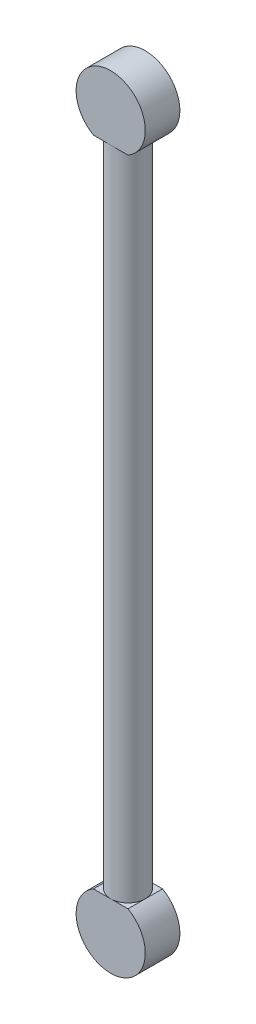
ISO-10303-21;
HEADER;
FILE_DESCRIPTION(('STEP AP214'),'2;1');
FILE_NAME('part.step','',(''),(''),'','','');
FILE_SCHEMA(('AUTOMOTIVE_DESIGN { 1 0 10303 214 1 1 1 1 }'));
ENDSEC;
DATA;
#1=APPLICATION_CONTEXT('core data for automotive mechanical design processes');
#2=APPLICATION_PROTOCOL_DEFINITION('international standard','automotive_design',2000,#1);
#3=PRODUCT_CONTEXT('',#1,'mechanical');
#4=PRODUCT('Part','Part','',(#3));
#5=PRODUCT_RELATED_PRODUCT_CATEGORY('part','',(#4));
#6=PRODUCT_DEFINITION_FORMATION('','',#4);
#7=PRODUCT_DEFINITION_CONTEXT('part definition',#1,'design');
#8=PRODUCT_DEFINITION('design','',#6,#7);
#9=PRODUCT_DEFINITION_SHAPE('','',#8);
#10=(LENGTH_UNIT() NAMED_UNIT(*) SI_UNIT(.MILLI.,.METRE.));
#11=(NAMED_UNIT(*) PLANE_ANGLE_UNIT() SI_UNIT($,.RADIAN.));
#12=(NAMED_UNIT(*) SI_UNIT($,.STERADIAN.) SOLID_ANGLE_UNIT());
#13=UNCERTAINTY_MEASURE_WITH_UNIT(LENGTH_MEASURE(1.E-05),#10,'distance_accuracy_value','');
#14=(GEOMETRIC_REPRESENTATION_CONTEXT(3) GLOBAL_UNCERTAINTY_ASSIGNED_CONTEXT((#13)) GLOBAL_UNIT_ASSIGNED_CONTEXT((#10,
#11,#12)) REPRESENTATION_CONTEXT('',''));
#15=CARTESIAN_POINT('',(0.,0.,0.));
#16=DIRECTION('',(0.,0.,1.));
#17=DIRECTION('',(1.,0.,0.));
#18=AXIS2_PLACEMENT_3D('',#15,#16,#17);
#19=CARTESIAN_POINT('',(0.,119.888,0.));
#20=DIRECTION('',(0.,-1.,0.));
#21=DIRECTION('',(0.,0.,-1.));
#22=AXIS2_PLACEMENT_3D('',#19,#20,#21);
#23=CYLINDRICAL_SURFACE('',#22,3.175);
#24=CARTESIAN_POINT('',(0.,119.888,0.));
#25=DIRECTION('',(0.,1.,0.));
#26=DIRECTION('',(0.,0.,1.));
#27=AXIS2_PLACEMENT_3D('',#24,#25,#26);
#28=CIRCLE('',#27,3.175);
#29=CARTESIAN_POINT('',(0.,119.888,3.175));
#30=VERTEX_POINT('',#29);
#31=CARTESIAN_POINT('',(3.175,119.888,0.));
#32=VERTEX_POINT('',#31);
#33=EDGE_CURVE('E11',#30,#32,#28,.T.);
#34=ORIENTED_EDGE('',*,*,#33,.F.);
#35=CARTESIAN_POINT('',(-3.175,119.888,0.));
#36=VERTEX_POINT('',#35);
#37=EDGE_CURVE('E47',#36,#30,#28,.T.);
#38=ORIENTED_EDGE('',*,*,#37,.F.);
#39=CARTESIAN_POINT('',(0.,119.888,-3.175));
#40=VERTEX_POINT('',#39);
#41=EDGE_CURVE('E157',#40,#36,#28,.T.);
#42=ORIENTED_EDGE('',*,*,#41,.F.);
#43=EDGE_CURVE('E46',#32,#40,#28,.T.);
#44=ORIENTED_EDGE('',*,*,#43,.F.);
#45=EDGE_LOOP('',(#34,#38,#42,#44));
#46=FACE_BOUND('',#45,.T.);
#47=CARTESIAN_POINT('',(0.,0.,0.));
#48=DIRECTION('',(0.,1.,0.));
#49=DIRECTION('',(0.,0.,1.));
#50=AXIS2_PLACEMENT_3D('',#47,#48,#49);
#51=CIRCLE('',#50,3.175);
#52=CARTESIAN_POINT('',(0.,0.,3.175));
#53=VERTEX_POINT('',#52);
#54=CARTESIAN_POINT('',(3.175,0.,0.));
#55=VERTEX_POINT('',#54);
#56=EDGE_CURVE('E41',#53,#55,#51,.T.);
#57=ORIENTED_EDGE('',*,*,#56,.T.);
#58=CARTESIAN_POINT('',(0.,0.,-3.175));
#59=VERTEX_POINT('',#58);
#60=EDGE_CURVE('E172',#55,#59,#51,.T.);
#61=ORIENTED_EDGE('',*,*,#60,.T.);
#62=CARTESIAN_POINT('',(-3.175,0.,0.));
#63=VERTEX_POINT('',#62);
#64=EDGE_CURVE('E152',#59,#63,#51,.T.);
#65=ORIENTED_EDGE('',*,*,#64,.T.);
#66=EDGE_CURVE('E149',#63,#53,#51,.T.);
#67=ORIENTED_EDGE('',*,*,#66,.T.);
#68=EDGE_LOOP('',(#57,#61,#65,#67));
#69=FACE_BOUND('',#68,.T.);
#70=ADVANCED_FACE('F38',(#46,#69),#23,.T.);
#71=CARTESIAN_POINT('',(-3.175,119.888,3.175));
#72=DIRECTION('',(0.,1.,0.));
#73=DIRECTION('',(0.,0.,1.));
#74=AXIS2_PLACEMENT_3D('',#71,#72,#73);
#75=PLANE('',#74);
#76=DIRECTION('',(1.,0.,0.));
#77=VECTOR('',#76,1.);
#78=CARTESIAN_POINT('',(-3.175,119.888,3.175));
#79=LINE('',#78,#77);
#80=CARTESIAN_POINT('',(3.175,119.888,3.175));
#81=VERTEX_POINT('',#80);
#82=EDGE_CURVE('E135',#30,#81,#79,.T.);
#83=ORIENTED_EDGE('',*,*,#82,.F.);
#84=ORIENTED_EDGE('',*,*,#33,.T.);
#85=DIRECTION('',(0.,0.,-1.));
#86=VECTOR('',#85,1.);
#87=CARTESIAN_POINT('',(3.175,119.888,3.175));
#88=LINE('',#87,#86);
#89=EDGE_CURVE('E143',#81,#32,#88,.T.);
#90=ORIENTED_EDGE('',*,*,#89,.F.);
#91=EDGE_LOOP('',(#83,#84,#90));
#92=FACE_BOUND('',#91,.T.);
#93=ADVANCED_FACE('F204',(#92),#75,.F.);
#94=CARTESIAN_POINT('',(3.175,119.888,-3.175));
#95=VERTEX_POINT('',#94);
#96=EDGE_CURVE('E139',#32,#95,#88,.T.);
#97=ORIENTED_EDGE('',*,*,#96,.F.);
#98=ORIENTED_EDGE('',*,*,#43,.T.);
#99=DIRECTION('',(1.,0.,0.));
#100=VECTOR('',#99,1.);
#101=CARTESIAN_POINT('',(-3.175,119.888,-3.175));
#102=LINE('',#101,#100);
#103=EDGE_CURVE('E127',#40,#95,#102,.T.);
#104=ORIENTED_EDGE('',*,*,#103,.T.);
#105=EDGE_LOOP('',(#97,#98,#104));
#106=FACE_BOUND('',#105,.T.);
#107=ADVANCED_FACE('F170',(#106),#75,.F.);
#108=CARTESIAN_POINT('',(-3.175,119.888,-3.175));
#109=VERTEX_POINT('',#108);
#110=EDGE_CURVE('E136',#109,#40,#102,.T.);
#111=ORIENTED_EDGE('',*,*,#110,.T.);
#112=ORIENTED_EDGE('',*,*,#41,.T.);
#113=DIRECTION('',(0.,0.,-1.));
#114=VECTOR('',#113,1.);
#115=CARTESIAN_POINT('',(-3.175,119.888,3.175));
#116=LINE('',#115,#114);
#117=EDGE_CURVE('E146',#36,#109,#116,.T.);
#118=ORIENTED_EDGE('',*,*,#117,.T.);
#119=EDGE_LOOP('',(#111,#112,#118));
#120=FACE_BOUND('',#119,.T.);
#121=ADVANCED_FACE('F156',(#120),#75,.F.);
#122=CARTESIAN_POINT('',(0.,125.387261314031,3.175));
#123=DIRECTION('',(0.,0.,-1.));
#124=DIRECTION('',(-1.,0.,0.));
#125=AXIS2_PLACEMENT_3D('',#122,#123,#124);
#126=CYLINDRICAL_SURFACE('',#125,6.35000000000001);
#127=CARTESIAN_POINT('',(0.,125.387261314031,-3.175));
#128=DIRECTION('',(0.,0.,1.));
#129=DIRECTION('',(-1.,0.,0.));
#130=AXIS2_PLACEMENT_3D('',#127,#128,#129);
#131=CIRCLE('',#130,6.35000000000001);
#132=EDGE_CURVE('E124',#95,#109,#131,.T.);
#133=ORIENTED_EDGE('',*,*,#132,.T.);
#134=ORIENTED_EDGE('',*,*,#117,.F.);
#135=CARTESIAN_POINT('',(-3.175,119.888,3.175));
#136=VERTEX_POINT('',#135);
#137=EDGE_CURVE('E147',#136,#36,#116,.T.);
#138=ORIENTED_EDGE('',*,*,#137,.F.);
#139=CARTESIAN_POINT('',(0.,125.387261314031,3.175));
#140=DIRECTION('',(0.,0.,1.));
#141=DIRECTION('',(-1.,0.,0.));
#142=AXIS2_PLACEMENT_3D('',#139,#140,#141);
#143=CIRCLE('',#142,6.35000000000001);
#144=EDGE_CURVE('E132',#81,#136,#143,.T.);
#145=ORIENTED_EDGE('',*,*,#144,.F.);
#146=ORIENTED_EDGE('',*,*,#89,.T.);
#147=ORIENTED_EDGE('',*,*,#96,.T.);
#148=EDGE_LOOP('',(#133,#134,#138,#145,#146,#147));
#149=FACE_BOUND('',#148,.T.);
#150=ADVANCED_FACE('F164',(#149),#126,.T.);
#151=ORIENTED_EDGE('',*,*,#137,.T.);
#152=ORIENTED_EDGE('',*,*,#37,.T.);
#153=EDGE_CURVE('E137',#136,#30,#79,.T.);
#154=ORIENTED_EDGE('',*,*,#153,.F.);
#155=EDGE_LOOP('',(#151,#152,#154));
#156=FACE_BOUND('',#155,.T.);
#157=ADVANCED_FACE('F210',(#156),#75,.F.);
#158=CARTESIAN_POINT('',(0.,125.387261314031,3.175));
#159=DIRECTION('',(0.,0.,-1.));
#160=DIRECTION('',(-1.,0.,0.));
#161=AXIS2_PLACEMENT_3D('',#158,#159,#160);
#162=PLANE('',#161);
#163=ORIENTED_EDGE('',*,*,#144,.T.);
#164=ORIENTED_EDGE('',*,*,#153,.T.);
#165=ORIENTED_EDGE('',*,*,#82,.T.);
#166=EDGE_LOOP('',(#163,#164,#165));
#167=FACE_BOUND('',#166,.T.);
#168=ADVANCED_FACE('F198',(#167),#162,.F.);
#169=CARTESIAN_POINT('',(0.,125.387261314031,-3.175));
#170=DIRECTION('',(0.,0.,-1.));
#171=DIRECTION('',(-1.,0.,0.));
#172=AXIS2_PLACEMENT_3D('',#169,#170,#171);
#173=PLANE('',#172);
#174=ORIENTED_EDGE('',*,*,#132,.F.);
#175=ORIENTED_EDGE('',*,*,#103,.F.);
#176=ORIENTED_EDGE('',*,*,#110,.F.);
#177=EDGE_LOOP('',(#174,#175,#176));
#178=FACE_BOUND('',#177,.T.);
#179=ADVANCED_FACE('F162',(#178),#173,.T.);
#180=CARTESIAN_POINT('',(-3.175,0.,3.175));
#181=DIRECTION('',(0.,-1.,0.));
#182=DIRECTION('',(0.,0.,-1.));
#183=AXIS2_PLACEMENT_3D('',#180,#181,#182);
#184=PLANE('',#183);
#185=DIRECTION('',(-1.,0.,0.));
#186=VECTOR('',#185,1.);
#187=CARTESIAN_POINT('',(-3.175,0.,-3.175));
#188=LINE('',#187,#186);
#189=CARTESIAN_POINT('',(3.175,0.,-3.175));
#190=VERTEX_POINT('',#189);
#191=EDGE_CURVE('E118',#190,#59,#188,.T.);
#192=ORIENTED_EDGE('',*,*,#191,.T.);
#193=ORIENTED_EDGE('',*,*,#60,.F.);
#194=DIRECTION('',(0.,0.,-1.));
#195=VECTOR('',#194,1.);
#196=CARTESIAN_POINT('',(3.175,0.,3.175));
#197=LINE('',#196,#195);
#198=EDGE_CURVE('E123',#55,#190,#197,.T.);
#199=ORIENTED_EDGE('',*,*,#198,.T.);
#200=EDGE_LOOP('',(#192,#193,#199));
#201=FACE_BOUND('',#200,.T.);
#202=ADVANCED_FACE('F189',(#201),#184,.F.);
#203=CARTESIAN_POINT('',(3.175,0.,3.175));
#204=VERTEX_POINT('',#203);
#205=EDGE_CURVE('E108',#204,#55,#197,.T.);
#206=ORIENTED_EDGE('',*,*,#205,.T.);
#207=ORIENTED_EDGE('',*,*,#56,.F.);
#208=DIRECTION('',(-1.,0.,0.));
#209=VECTOR('',#208,1.);
#210=CARTESIAN_POINT('',(-3.175,0.,3.175));
#211=LINE('',#210,#209);
#212=EDGE_CURVE('E104',#204,#53,#211,.T.);
#213=ORIENTED_EDGE('',*,*,#212,.F.);
#214=EDGE_LOOP('',(#206,#207,#213));
#215=FACE_BOUND('',#214,.T.);
#216=ADVANCED_FACE('F106',(#215),#184,.F.);
#217=CARTESIAN_POINT('',(-3.175,0.,3.175));
#218=VERTEX_POINT('',#217);
#219=EDGE_CURVE('E114',#53,#218,#211,.T.);
#220=ORIENTED_EDGE('',*,*,#219,.F.);
#221=ORIENTED_EDGE('',*,*,#66,.F.);
#222=DIRECTION('',(0.,0.,-1.));
#223=VECTOR('',#222,1.);
#224=CARTESIAN_POINT('',(-3.175,0.,3.175));
#225=LINE('',#224,#223);
#226=EDGE_CURVE('E54',#218,#63,#225,.T.);
#227=ORIENTED_EDGE('',*,*,#226,.F.);
#228=EDGE_LOOP('',(#220,#221,#227));
#229=FACE_BOUND('',#228,.T.);
#230=ADVANCED_FACE('F197',(#229),#184,.F.);
#231=CARTESIAN_POINT('',(0.,-5.4992613140312,3.175));
#232=DIRECTION('',(0.,0.,-1.));
#233=DIRECTION('',(-1.,0.,0.));
#234=AXIS2_PLACEMENT_3D('',#231,#232,#233);
#235=CYLINDRICAL_SURFACE('',#234,6.35000000000001);
#236=CARTESIAN_POINT('',(0.,-5.4992613140312,-3.175));
#237=DIRECTION('',(0.,0.,1.));
#238=DIRECTION('',(1.,0.,0.));
#239=AXIS2_PLACEMENT_3D('',#236,#237,#238);
#240=CIRCLE('',#239,6.35000000000001);
#241=CARTESIAN_POINT('',(-3.175,0.,-3.175));
#242=VERTEX_POINT('',#241);
#243=EDGE_CURVE('E187',#242,#190,#240,.T.);
#244=ORIENTED_EDGE('',*,*,#243,.T.);
#245=ORIENTED_EDGE('',*,*,#198,.F.);
#246=ORIENTED_EDGE('',*,*,#205,.F.);
#247=CARTESIAN_POINT('',(0.,-5.4992613140312,3.175));
#248=DIRECTION('',(0.,0.,1.));
#249=DIRECTION('',(1.,0.,0.));
#250=AXIS2_PLACEMENT_3D('',#247,#248,#249);
#251=CIRCLE('',#250,6.35000000000001);
#252=EDGE_CURVE('E116',#218,#204,#251,.T.);
#253=ORIENTED_EDGE('',*,*,#252,.F.);
#254=ORIENTED_EDGE('',*,*,#226,.T.);
#255=EDGE_CURVE('E113',#63,#242,#225,.T.);
#256=ORIENTED_EDGE('',*,*,#255,.T.);
#257=EDGE_LOOP('',(#244,#245,#246,#253,#254,#256));
#258=FACE_BOUND('',#257,.T.);
#259=ADVANCED_FACE('F122',(#258),#235,.T.);
#260=ORIENTED_EDGE('',*,*,#255,.F.);
#261=ORIENTED_EDGE('',*,*,#64,.F.);
#262=EDGE_CURVE('E181',#59,#242,#188,.T.);
#263=ORIENTED_EDGE('',*,*,#262,.T.);
#264=EDGE_LOOP('',(#260,#261,#263));
#265=FACE_BOUND('',#264,.T.);
#266=ADVANCED_FACE('F180',(#265),#184,.F.);
#267=CARTESIAN_POINT('',(0.,-5.4992613140312,3.175));
#268=DIRECTION('',(0.,0.,1.));
#269=DIRECTION('',(1.,0.,0.));
#270=AXIS2_PLACEMENT_3D('',#267,#268,#269);
#271=PLANE('',#270);
#272=ORIENTED_EDGE('',*,*,#252,.T.);
#273=ORIENTED_EDGE('',*,*,#212,.T.);
#274=ORIENTED_EDGE('',*,*,#219,.T.);
#275=EDGE_LOOP('',(#272,#273,#274));
#276=FACE_BOUND('',#275,.T.);
#277=ADVANCED_FACE('F117',(#276),#271,.T.);
#278=CARTESIAN_POINT('',(0.,-5.4992613140312,-3.175));
#279=DIRECTION('',(0.,0.,1.));
#280=DIRECTION('',(1.,0.,0.));
#281=AXIS2_PLACEMENT_3D('',#278,#279,#280);
#282=PLANE('',#281);
#283=ORIENTED_EDGE('',*,*,#243,.F.);
#284=ORIENTED_EDGE('',*,*,#262,.F.);
#285=ORIENTED_EDGE('',*,*,#191,.F.);
#286=EDGE_LOOP('',(#283,#284,#285));
#287=FACE_BOUND('',#286,.T.);
#288=ADVANCED_FACE('F186',(#287),#282,.F.);
#289=CLOSED_SHELL('',(#70,#93,#107,#121,#150,#157,#168,#179,#202,#216,#230,#259,#266,#277,#288));
#290=MANIFOLD_SOLID_BREP('B2',#289);
#291=ADVANCED_BREP_SHAPE_REPRESENTATION('',(#18,#290),#14);
#292=SHAPE_DEFINITION_REPRESENTATION(#9,#291);
ENDSEC;
END-ISO-10303-21;
